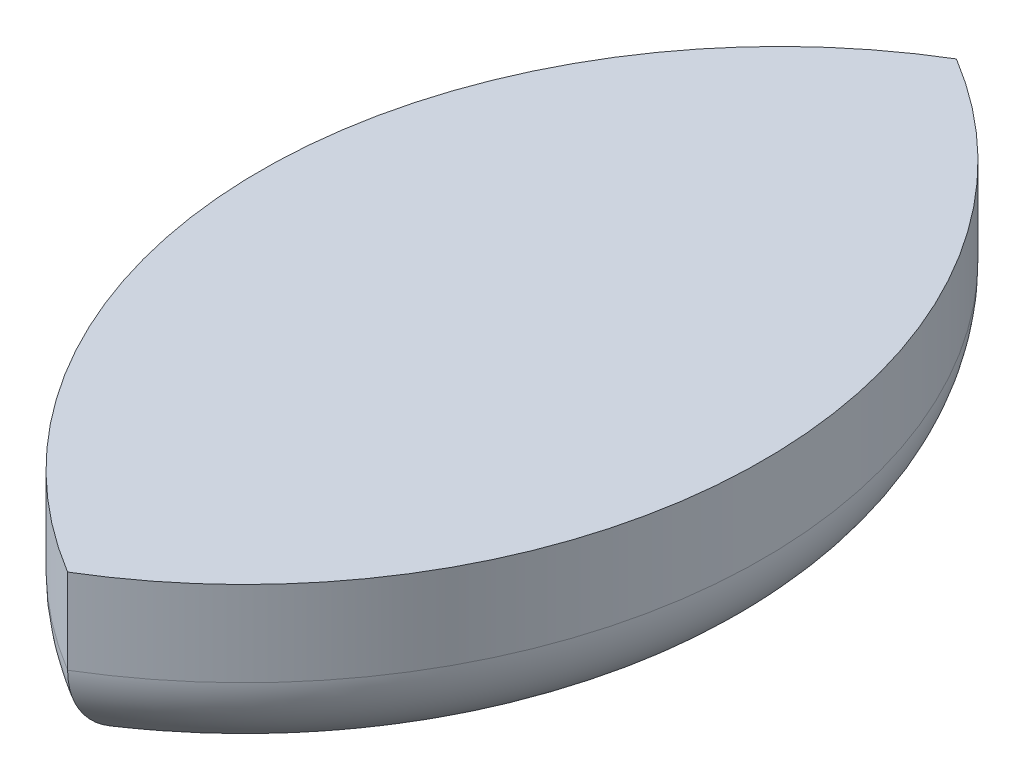
ISO-10303-21;
HEADER;
FILE_DESCRIPTION(('STEP AP214'),'2;1');
FILE_NAME('part.step','',(''),(''),'','','');
FILE_SCHEMA(('AUTOMOTIVE_DESIGN { 1 0 10303 214 1 1 1 1 }'));
ENDSEC;
DATA;
#1=APPLICATION_CONTEXT('core data for automotive mechanical design processes');
#2=APPLICATION_PROTOCOL_DEFINITION('international standard','automotive_design',2000,#1);
#3=PRODUCT_CONTEXT('',#1,'mechanical');
#4=PRODUCT('Part','Part','',(#3));
#5=PRODUCT_RELATED_PRODUCT_CATEGORY('part','',(#4));
#6=PRODUCT_DEFINITION_FORMATION('','',#4);
#7=PRODUCT_DEFINITION_CONTEXT('part definition',#1,'design');
#8=PRODUCT_DEFINITION('design','',#6,#7);
#9=PRODUCT_DEFINITION_SHAPE('','',#8);
#10=(LENGTH_UNIT() NAMED_UNIT(*) SI_UNIT(.MILLI.,.METRE.));
#11=(NAMED_UNIT(*) PLANE_ANGLE_UNIT() SI_UNIT($,.RADIAN.));
#12=(NAMED_UNIT(*) SI_UNIT($,.STERADIAN.) SOLID_ANGLE_UNIT());
#13=UNCERTAINTY_MEASURE_WITH_UNIT(LENGTH_MEASURE(1.E-05),#10,'distance_accuracy_value','');
#14=(GEOMETRIC_REPRESENTATION_CONTEXT(3) GLOBAL_UNCERTAINTY_ASSIGNED_CONTEXT((#13)) GLOBAL_UNIT_ASSIGNED_CONTEXT((#10,
#11,#12)) REPRESENTATION_CONTEXT('',''));
#15=CARTESIAN_POINT('',(0.,0.,0.));
#16=DIRECTION('',(0.,0.,1.));
#17=DIRECTION('',(1.,0.,0.));
#18=AXIS2_PLACEMENT_3D('',#15,#16,#17);
#19=CARTESIAN_POINT('',(-79.8952666666666,50.8,0.));
#20=DIRECTION('',(0.,-1.,0.));
#21=DIRECTION('',(0.,0.,-1.));
#22=AXIS2_PLACEMENT_3D('',#19,#20,#21);
#23=CYLINDRICAL_SURFACE('',#22,154.895266666667);
#24=DIRECTION('',(0.,-1.,0.));
#25=VECTOR('',#24,1.);
#26=CARTESIAN_POINT('',(0.,50.8,132.7));
#27=LINE('',#26,#25);
#28=CARTESIAN_POINT('',(0.,50.8,132.7));
#29=VERTEX_POINT('',#28);
#30=CARTESIAN_POINT('',(0.,25.4,132.7));
#31=VERTEX_POINT('',#30);
#32=EDGE_CURVE('E87',#29,#31,#27,.T.);
#33=ORIENTED_EDGE('',*,*,#32,.T.);
#34=CARTESIAN_POINT('',(-79.8952666666666,25.4,0.));
#35=DIRECTION('',(0.,1.,0.));
#36=DIRECTION('',(0.,0.,1.));
#37=AXIS2_PLACEMENT_3D('',#34,#35,#36);
#38=CIRCLE('',#37,154.895266666667);
#39=CARTESIAN_POINT('',(0.,25.4,-132.7));
#40=VERTEX_POINT('',#39);
#41=EDGE_CURVE('E53',#31,#40,#38,.T.);
#42=ORIENTED_EDGE('',*,*,#41,.T.);
#43=DIRECTION('',(0.,-1.,0.));
#44=VECTOR('',#43,1.);
#45=CARTESIAN_POINT('',(0.,50.8,-132.7));
#46=LINE('',#45,#44);
#47=CARTESIAN_POINT('',(0.,50.8,-132.7));
#48=VERTEX_POINT('',#47);
#49=EDGE_CURVE('E81',#48,#40,#46,.T.);
#50=ORIENTED_EDGE('',*,*,#49,.F.);
#51=CARTESIAN_POINT('',(-79.8952666666666,50.8,0.));
#52=DIRECTION('',(0.,1.,0.));
#53=DIRECTION('',(0.,0.,1.));
#54=AXIS2_PLACEMENT_3D('',#51,#52,#53);
#55=CIRCLE('',#54,154.895266666667);
#56=EDGE_CURVE('E84',#48,#29,#55,.F.);
#57=ORIENTED_EDGE('',*,*,#56,.T.);
#58=EDGE_LOOP('',(#33,#42,#50,#57));
#59=FACE_BOUND('',#58,.T.);
#60=ADVANCED_FACE('F38',(#59),#23,.T.);
#61=CARTESIAN_POINT('',(79.8952666666666,50.8,0.));
#62=DIRECTION('',(0.,-1.,0.));
#63=DIRECTION('',(0.,0.,-1.));
#64=AXIS2_PLACEMENT_3D('',#61,#62,#63);
#65=CYLINDRICAL_SURFACE('',#64,154.895266666667);
#66=ORIENTED_EDGE('',*,*,#49,.T.);
#67=CARTESIAN_POINT('',(79.8952666666666,25.4,0.));
#68=DIRECTION('',(0.,1.,0.));
#69=DIRECTION('',(0.,0.,1.));
#70=AXIS2_PLACEMENT_3D('',#67,#68,#69);
#71=CIRCLE('',#70,154.895266666667);
#72=EDGE_CURVE('E11',#40,#31,#71,.T.);
#73=ORIENTED_EDGE('',*,*,#72,.T.);
#74=ORIENTED_EDGE('',*,*,#32,.F.);
#75=CARTESIAN_POINT('',(79.8952666666666,50.8,0.));
#76=DIRECTION('',(0.,1.,0.));
#77=DIRECTION('',(0.,0.,1.));
#78=AXIS2_PLACEMENT_3D('',#75,#76,#77);
#79=CIRCLE('',#78,154.895266666667);
#80=EDGE_CURVE('E89',#48,#29,#79,.T.);
#81=ORIENTED_EDGE('',*,*,#80,.F.);
#82=EDGE_LOOP('',(#66,#73,#74,#81));
#83=FACE_BOUND('',#82,.T.);
#84=ADVANCED_FACE('F90',(#83),#65,.T.);
#85=CARTESIAN_POINT('',(0.,50.8,0.));
#86=DIRECTION('',(0.,1.,0.));
#87=DIRECTION('',(0.,0.,1.));
#88=AXIS2_PLACEMENT_3D('',#85,#86,#87);
#89=PLANE('',#88);
#90=ORIENTED_EDGE('',*,*,#56,.F.);
#91=ORIENTED_EDGE('',*,*,#80,.T.);
#92=EDGE_LOOP('',(#90,#91));
#93=FACE_BOUND('',#92,.T.);
#94=ADVANCED_FACE('F94',(#93),#89,.T.);
#95=CARTESIAN_POINT('',(0.,0.,0.));
#96=DIRECTION('',(0.,1.,0.));
#97=DIRECTION('',(0.,0.,1.));
#98=AXIS2_PLACEMENT_3D('',#95,#96,#97);
#99=PLANE('',#98);
#100=CARTESIAN_POINT('',(79.8952666666666,0.,0.));
#101=DIRECTION('',(0.,1.,0.));
#102=DIRECTION('',(0.,0.,1.));
#103=AXIS2_PLACEMENT_3D('',#100,#101,#102);
#104=CIRCLE('',#103,129.495266666667);
#105=CARTESIAN_POINT('',(0.,0.,101.910600299151));
#106=VERTEX_POINT('',#105);
#107=CARTESIAN_POINT('',(0.,0.,-101.910600299151));
#108=VERTEX_POINT('',#107);
#109=EDGE_CURVE('E86',#106,#108,#104,.F.);
#110=ORIENTED_EDGE('',*,*,#109,.T.);
#111=CARTESIAN_POINT('',(-79.8952666666666,0.,0.));
#112=DIRECTION('',(0.,1.,0.));
#113=DIRECTION('',(0.,0.,1.));
#114=AXIS2_PLACEMENT_3D('',#111,#112,#113);
#115=CIRCLE('',#114,129.495266666667);
#116=EDGE_CURVE('E104',#108,#106,#115,.F.);
#117=ORIENTED_EDGE('',*,*,#116,.T.);
#118=EDGE_LOOP('',(#110,#117));
#119=FACE_BOUND('',#118,.T.);
#120=ADVANCED_FACE('F123',(#119),#99,.F.);
#121=CARTESIAN_POINT('',(79.8952666666666,25.4,0.));
#122=DIRECTION('',(0.,1.,0.));
#123=DIRECTION('',(0.,0.,1.));
#124=AXIS2_PLACEMENT_3D('',#121,#122,#123);
#125=TOROIDAL_SURFACE('',#124,129.495266666667,25.4);
#126=CARTESIAN_POINT('',(0.,25.4,132.7));
#127=CARTESIAN_POINT('',(0.,25.0812352099857,132.700002832068));
#128=CARTESIAN_POINT('',(0.,24.7625092602735,132.692994488735));
#129=CARTESIAN_POINT('',(0.,24.1256834658536,132.664998214311));
#130=CARTESIAN_POINT('',(0.,23.8075835986757,132.644010794457));
#131=CARTESIAN_POINT('',(0.,22.8553440906126,132.560172641392));
#132=CARTESIAN_POINT('',(0.,22.2229287382314,132.476445920718));
#133=CARTESIAN_POINT('',(0.,20.9703208963999,132.254790191797));
#134=CARTESIAN_POINT('',(0.,20.3500894469576,132.117080769537));
#135=CARTESIAN_POINT('',(0.,19.4304412682294,131.87120587473));
#136=CARTESIAN_POINT('',(0.,19.125652876194,131.782687775213));
#137=CARTESIAN_POINT('',(0.,18.5200346987547,131.592785832034));
#138=CARTESIAN_POINT('',(0.,18.2192058248213,131.491399081296));
#139=CARTESIAN_POINT('',(0.,17.3241276985139,131.16860571279));
#140=CARTESIAN_POINT('',(0.,16.7365642398888,130.92837206619));
#141=CARTESIAN_POINT('',(0.,15.5831858156474,130.400399221993));
#142=CARTESIAN_POINT('',(0.,15.0173722944499,130.112656876026));
#143=CARTESIAN_POINT('',(0.,14.1872496621903,129.647675044578));
#144=CARTESIAN_POINT('',(0.,13.9135203224019,129.487038285321));
#145=CARTESIAN_POINT('',(0.,13.3727105039933,129.155093012305));
#146=CARTESIAN_POINT('',(0.,13.1056282880233,128.983787328952));
#147=CARTESIAN_POINT('',(0.,12.3146764690622,128.454377928736));
#148=CARTESIAN_POINT('',(0.,11.8010810347947,128.080770256196));
#149=CARTESIAN_POINT('',(0.,10.7802741584093,127.277323486329));
#150=CARTESIAN_POINT('',(0.,10.2744991257882,126.845666105392));
#151=CARTESIAN_POINT('',(0.,9.2975254630449,125.944876539984));
#152=CARTESIAN_POINT('',(0.,8.82632767781915,125.475743440378));
#153=CARTESIAN_POINT('',(0.,7.91989500943882,124.503896238437));
#154=CARTESIAN_POINT('',(0.,7.48466403237857,124.001178499413));
#155=CARTESIAN_POINT('',(0.,6.6511257916629,122.965979972056));
#156=CARTESIAN_POINT('',(0.,6.2528230235172,122.43349557265));
#157=CARTESIAN_POINT('',(0.,5.44337801880062,121.270062575136));
#158=CARTESIAN_POINT('',(0.,5.0375393874927,120.6354214862));
#159=CARTESIAN_POINT('',(0.,4.27429043469936,119.337682623277));
#160=CARTESIAN_POINT('',(0.,3.91688404641227,118.674582543878));
#161=CARTESIAN_POINT('',(0.,3.25015999299248,117.32417295412));
#162=CARTESIAN_POINT('',(0.,2.94087195587476,116.636848845164));
#163=CARTESIAN_POINT('',(0.,2.37007422494313,115.242454493044));
#164=CARTESIAN_POINT('',(0.,2.10857999263552,114.53537794486));
#165=CARTESIAN_POINT('',(0.,1.59213493535113,112.983548973592));
#166=CARTESIAN_POINT('',(0.,1.34591005537947,112.135886993973));
#167=CARTESIAN_POINT('',(0.,0.916576870351388,110.424726994666));
#168=CARTESIAN_POINT('',(0.,0.733475647116977,109.561227209578));
#169=CARTESIAN_POINT('',(0.,0.428922760380373,107.824667799443));
#170=CARTESIAN_POINT('',(0.,0.307389792741177,106.95162234553));
#171=CARTESIAN_POINT('',(0.,0.123844223098526,105.199334772191));
#172=CARTESIAN_POINT('',(1.4266256172846E-13,0.0618292478967446,104.320092901247));
#173=CARTESIAN_POINT('',(0.,0.00991251659578045,102.941102222409));
#174=CARTESIAN_POINT('',(-2.56173483495314E-13,0.000406428771432425,102.442014844218));
#175=CARTESIAN_POINT('',(0.,4.25218492526724E-06,101.932164039323));
#176=CARTESIAN_POINT('',(0.,3.65085072720235E-10,101.921382163259));
#177=CARTESIAN_POINT('',(0.,0.,101.910600299151));
#178=B_SPLINE_CURVE_WITH_KNOTS('',3,(#126,#127,#128,#129,#130,#131,#132,#133,#134,#135,#136,
#137,#138,#139,#140,#141,#142,#143,#144,#145,#146,#147,#148,#149,#150,#151,#152,#153,#154,#155,
#156,#157,#158,#159,#160,#161,#162,#163,#164,#165,#166,#167,#168,#169,#170,#171,#172,#173,#174,
#175,#176,#177),.UNSPECIFIED.,.F.,.F.,(4,2,2,2,2,2,2,2,2,2,2,2,2,2,2,2,2,2,2,2,2,2,2,2,2,4),(0.,
0.956140187455428,1.91224540938454,3.82345197952965,5.72696366708683,6.67886044443728,
7.63097264279826,9.53295955955364,11.4350725702767,12.3870036257443,13.3386832062851,
15.241971477128,17.2347779802775,19.2276331615339,21.2207044886918,23.2140181276048,
25.4717065163154,27.7295781429016,29.9888345578597,32.2488205635417,34.8943369934706,
37.5401501264938,40.1824601556934,42.8246648220265,44.3218703482007,44.3542159755672),.UNSPECIFIED.);
#179=EDGE_CURVE('E98',#31,#106,#178,.T.);
#180=ORIENTED_EDGE('',*,*,#179,.F.);
#181=ORIENTED_EDGE('',*,*,#72,.F.);
#182=CARTESIAN_POINT('',(0.,25.4,-132.7));
#183=CARTESIAN_POINT('',(0.,25.0812352099857,-132.700002832068));
#184=CARTESIAN_POINT('',(0.,24.7625092602735,-132.692994488735));
#185=CARTESIAN_POINT('',(0.,24.1256834658536,-132.664998214311));
#186=CARTESIAN_POINT('',(0.,23.8075835986757,-132.644010794457));
#187=CARTESIAN_POINT('',(0.,22.8553440906126,-132.560172641392));
#188=CARTESIAN_POINT('',(0.,22.2229287382314,-132.476445920718));
#189=CARTESIAN_POINT('',(0.,20.9703208963999,-132.254790191797));
#190=CARTESIAN_POINT('',(0.,20.3500894469576,-132.117080769537));
#191=CARTESIAN_POINT('',(0.,19.4304412682294,-131.87120587473));
#192=CARTESIAN_POINT('',(0.,19.125652876194,-131.782687775213));
#193=CARTESIAN_POINT('',(0.,18.5200346987547,-131.592785832034));
#194=CARTESIAN_POINT('',(0.,18.2192058248213,-131.491399081296));
#195=CARTESIAN_POINT('',(0.,17.3241276985139,-131.16860571279));
#196=CARTESIAN_POINT('',(0.,16.7365642398888,-130.92837206619));
#197=CARTESIAN_POINT('',(0.,15.5831858156474,-130.400399221993));
#198=CARTESIAN_POINT('',(0.,15.0173722944499,-130.112656876026));
#199=CARTESIAN_POINT('',(0.,14.1872496621903,-129.647675044578));
#200=CARTESIAN_POINT('',(0.,13.9135203224019,-129.487038285321));
#201=CARTESIAN_POINT('',(0.,13.3727105039933,-129.155093012305));
#202=CARTESIAN_POINT('',(0.,13.1056282880233,-128.983787328952));
#203=CARTESIAN_POINT('',(0.,12.3146764690622,-128.454377928736));
#204=CARTESIAN_POINT('',(0.,11.8010810347947,-128.080770256196));
#205=CARTESIAN_POINT('',(0.,10.7802741584093,-127.277323486329));
#206=CARTESIAN_POINT('',(0.,10.2744991257882,-126.845666105392));
#207=CARTESIAN_POINT('',(0.,9.2975254630449,-125.944876539984));
#208=CARTESIAN_POINT('',(0.,8.82632767781915,-125.475743440378));
#209=CARTESIAN_POINT('',(0.,7.91989500943882,-124.503896238437));
#210=CARTESIAN_POINT('',(0.,7.48466403237857,-124.001178499413));
#211=CARTESIAN_POINT('',(0.,6.6511257916629,-122.965979972056));
#212=CARTESIAN_POINT('',(0.,6.2528230235172,-122.43349557265));
#213=CARTESIAN_POINT('',(0.,5.44337801880062,-121.270062575136));
#214=CARTESIAN_POINT('',(0.,5.0375393874927,-120.6354214862));
#215=CARTESIAN_POINT('',(0.,4.27429043469936,-119.337682623277));
#216=CARTESIAN_POINT('',(0.,3.91688404641227,-118.674582543878));
#217=CARTESIAN_POINT('',(0.,3.25015999299248,-117.32417295412));
#218=CARTESIAN_POINT('',(0.,2.94087195587476,-116.636848845164));
#219=CARTESIAN_POINT('',(0.,2.37007422494313,-115.242454493044));
#220=CARTESIAN_POINT('',(0.,2.10857999263552,-114.53537794486));
#221=CARTESIAN_POINT('',(0.,1.59213493535113,-112.983548973592));
#222=CARTESIAN_POINT('',(0.,1.34591005537947,-112.135886993973));
#223=CARTESIAN_POINT('',(0.,0.916576870351388,-110.424726994666));
#224=CARTESIAN_POINT('',(0.,0.733475647116977,-109.561227209578));
#225=CARTESIAN_POINT('',(0.,0.428922760380373,-107.824667799443));
#226=CARTESIAN_POINT('',(0.,0.307389792741177,-106.95162234553));
#227=CARTESIAN_POINT('',(0.,0.123844223098526,-105.199334772191));
#228=CARTESIAN_POINT('',(1.4266256172846E-13,0.0618292478967446,-104.320092901247));
#229=CARTESIAN_POINT('',(0.,0.00991251659578045,-102.941102222409));
#230=CARTESIAN_POINT('',(-2.56173483495314E-13,0.000406428771432425,-102.442014844218));
#231=CARTESIAN_POINT('',(0.,4.25218492526724E-06,-101.932164039323));
#232=CARTESIAN_POINT('',(0.,3.65085072720235E-10,-101.921382163259));
#233=CARTESIAN_POINT('',(0.,0.,-101.910600299151));
#234=B_SPLINE_CURVE_WITH_KNOTS('',3,(#182,#183,#184,#185,#186,#187,#188,#189,#190,#191,#192,
#193,#194,#195,#196,#197,#198,#199,#200,#201,#202,#203,#204,#205,#206,#207,#208,#209,#210,#211,
#212,#213,#214,#215,#216,#217,#218,#219,#220,#221,#222,#223,#224,#225,#226,#227,#228,#229,#230,
#231,#232,#233),.UNSPECIFIED.,.F.,.F.,(4,2,2,2,2,2,2,2,2,2,2,2,2,2,2,2,2,2,2,2,2,2,2,2,2,4),(0.,
0.956140187455428,1.91224540938454,3.82345197952965,5.72696366708683,6.67886044443728,
7.63097264279826,9.53295955955364,11.4350725702767,12.3870036257443,13.3386832062851,
15.241971477128,17.2347779802775,19.2276331615339,21.2207044886918,23.2140181276048,
25.4717065163154,27.7295781429016,29.9888345578597,32.2488205635417,34.8943369934706,
37.5401501264938,40.1824601556934,42.8246648220265,44.3218703482007,44.3542159755672),.UNSPECIFIED.);
#235=EDGE_CURVE('E43',#108,#40,#234,.F.);
#236=ORIENTED_EDGE('',*,*,#235,.F.);
#237=ORIENTED_EDGE('',*,*,#109,.F.);
#238=EDGE_LOOP('',(#180,#181,#236,#237));
#239=FACE_BOUND('',#238,.T.);
#240=ADVANCED_FACE('F40',(#239),#125,.T.);
#241=CARTESIAN_POINT('',(-79.8952666666666,25.4,0.));
#242=DIRECTION('',(0.,1.,0.));
#243=DIRECTION('',(0.,0.,1.));
#244=AXIS2_PLACEMENT_3D('',#241,#242,#243);
#245=TOROIDAL_SURFACE('',#244,129.495266666667,25.4);
#246=ORIENTED_EDGE('',*,*,#235,.T.);
#247=ORIENTED_EDGE('',*,*,#41,.F.);
#248=ORIENTED_EDGE('',*,*,#179,.T.);
#249=ORIENTED_EDGE('',*,*,#116,.F.);
#250=EDGE_LOOP('',(#246,#247,#248,#249));
#251=FACE_BOUND('',#250,.T.);
#252=ADVANCED_FACE('F114',(#251),#245,.T.);
#253=CLOSED_SHELL('',(#60,#84,#94,#120,#240,#252));
#254=MANIFOLD_SOLID_BREP('B2',#253);
#255=ADVANCED_BREP_SHAPE_REPRESENTATION('',(#18,#254),#14);
#256=SHAPE_DEFINITION_REPRESENTATION(#9,#255);
ENDSEC;
END-ISO-10303-21;
